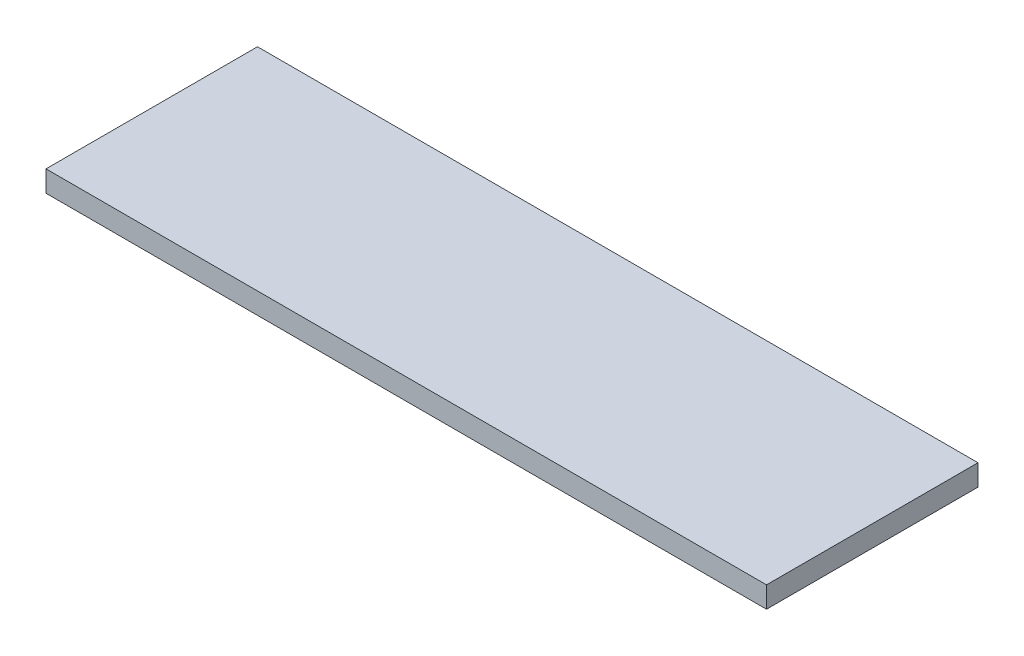
ISO-10303-21;
HEADER;
FILE_DESCRIPTION(('STEP AP214'),'2;1');
FILE_NAME('part.step','',(''),(''),'','','');
FILE_SCHEMA(('AUTOMOTIVE_DESIGN { 1 0 10303 214 1 1 1 1 }'));
ENDSEC;
DATA;
#1=APPLICATION_CONTEXT('core data for automotive mechanical design processes');
#2=APPLICATION_PROTOCOL_DEFINITION('international standard','automotive_design',2000,#1);
#3=PRODUCT_CONTEXT('',#1,'mechanical');
#4=PRODUCT('Part','Part','',(#3));
#5=PRODUCT_RELATED_PRODUCT_CATEGORY('part','',(#4));
#6=PRODUCT_DEFINITION_FORMATION('','',#4);
#7=PRODUCT_DEFINITION_CONTEXT('part definition',#1,'design');
#8=PRODUCT_DEFINITION('design','',#6,#7);
#9=PRODUCT_DEFINITION_SHAPE('','',#8);
#10=(LENGTH_UNIT() NAMED_UNIT(*) SI_UNIT(.MILLI.,.METRE.));
#11=(NAMED_UNIT(*) PLANE_ANGLE_UNIT() SI_UNIT($,.RADIAN.));
#12=(NAMED_UNIT(*) SI_UNIT($,.STERADIAN.) SOLID_ANGLE_UNIT());
#13=UNCERTAINTY_MEASURE_WITH_UNIT(LENGTH_MEASURE(1.E-05),#10,'distance_accuracy_value','');
#14=(GEOMETRIC_REPRESENTATION_CONTEXT(3) GLOBAL_UNCERTAINTY_ASSIGNED_CONTEXT((#13)) GLOBAL_UNIT_ASSIGNED_CONTEXT((#10,
#11,#12)) REPRESENTATION_CONTEXT('',''));
#15=CARTESIAN_POINT('',(0.,0.,0.));
#16=DIRECTION('',(0.,0.,1.));
#17=DIRECTION('',(1.,0.,0.));
#18=AXIS2_PLACEMENT_3D('',#15,#16,#17);
#19=CARTESIAN_POINT('',(18.068583470577,4.,10.));
#20=DIRECTION('',(0.,0.,1.));
#21=DIRECTION('',(0.,-1.,0.));
#22=AXIS2_PLACEMENT_3D('',#19,#20,#21);
#23=PLANE('',#22);
#24=DIRECTION('',(1.,0.,0.));
#25=VECTOR('',#24,1.);
#26=CARTESIAN_POINT('',(19.068583470577,0.,10.));
#27=LINE('',#26,#25);
#28=CARTESIAN_POINT('',(0.,0.,10.));
#29=VERTEX_POINT('',#28);
#30=CARTESIAN_POINT('',(34.068583470577,0.,10.));
#31=VERTEX_POINT('',#30);
#32=EDGE_CURVE('E102',#29,#31,#27,.T.);
#33=ORIENTED_EDGE('',*,*,#32,.F.);
#34=DIRECTION('',(0.,1.,0.));
#35=VECTOR('',#34,1.);
#36=CARTESIAN_POINT('',(0.,-1.,10.));
#37=LINE('',#36,#35);
#38=CARTESIAN_POINT('',(0.,-1.,10.));
#39=VERTEX_POINT('',#38);
#40=EDGE_CURVE('E99',#39,#29,#37,.T.);
#41=ORIENTED_EDGE('',*,*,#40,.F.);
#42=DIRECTION('',(1.,0.,0.));
#43=VECTOR('',#42,1.);
#44=CARTESIAN_POINT('',(19.068583470577,-1.,10.));
#45=LINE('',#44,#43);
#46=CARTESIAN_POINT('',(34.068583470577,-1.,10.));
#47=VERTEX_POINT('',#46);
#48=EDGE_CURVE('E88',#39,#47,#45,.T.);
#49=ORIENTED_EDGE('',*,*,#48,.T.);
#50=DIRECTION('',(0.,-1.,0.));
#51=VECTOR('',#50,1.);
#52=CARTESIAN_POINT('',(34.068583470577,0.,10.));
#53=LINE('',#52,#51);
#54=EDGE_CURVE('E91',#31,#47,#53,.T.);
#55=ORIENTED_EDGE('',*,*,#54,.F.);
#56=EDGE_LOOP('',(#33,#41,#49,#55));
#57=FACE_BOUND('',#56,.T.);
#58=ADVANCED_FACE('F44',(#57),#23,.T.);
#59=CARTESIAN_POINT('',(19.068583470577,-1.,10.));
#60=DIRECTION('',(0.,1.,0.));
#61=DIRECTION('',(0.,0.,1.));
#62=AXIS2_PLACEMENT_3D('',#59,#60,#61);
#63=PLANE('',#62);
#64=DIRECTION('',(1.,0.,0.));
#65=VECTOR('',#64,1.);
#66=CARTESIAN_POINT('',(19.068583470577,-1.,0.));
#67=LINE('',#66,#65);
#68=CARTESIAN_POINT('',(0.,-1.,0.));
#69=VERTEX_POINT('',#68);
#70=CARTESIAN_POINT('',(34.068583470577,-1.,0.));
#71=VERTEX_POINT('',#70);
#72=EDGE_CURVE('E77',#69,#71,#67,.T.);
#73=ORIENTED_EDGE('',*,*,#72,.T.);
#74=DIRECTION('',(0.,0.,-1.));
#75=VECTOR('',#74,1.);
#76=CARTESIAN_POINT('',(34.068583470577,-1.,10.));
#77=LINE('',#76,#75);
#78=EDGE_CURVE('E12',#47,#71,#77,.T.);
#79=ORIENTED_EDGE('',*,*,#78,.F.);
#80=ORIENTED_EDGE('',*,*,#48,.F.);
#81=DIRECTION('',(0.,0.,-1.));
#82=VECTOR('',#81,1.);
#83=CARTESIAN_POINT('',(0.,-1.,10.));
#84=LINE('',#83,#82);
#85=EDGE_CURVE('E90',#39,#69,#84,.T.);
#86=ORIENTED_EDGE('',*,*,#85,.T.);
#87=EDGE_LOOP('',(#73,#79,#80,#86));
#88=FACE_BOUND('',#87,.T.);
#89=ADVANCED_FACE('F86',(#88),#63,.F.);
#90=CARTESIAN_POINT('',(34.068583470577,0.,10.));
#91=DIRECTION('',(1.,0.,0.));
#92=DIRECTION('',(0.,0.,1.));
#93=AXIS2_PLACEMENT_3D('',#90,#91,#92);
#94=PLANE('',#93);
#95=DIRECTION('',(0.,-1.,0.));
#96=VECTOR('',#95,1.);
#97=CARTESIAN_POINT('',(34.068583470577,0.,0.));
#98=LINE('',#97,#96);
#99=CARTESIAN_POINT('',(34.068583470577,0.,0.));
#100=VERTEX_POINT('',#99);
#101=EDGE_CURVE('E111',#100,#71,#98,.T.);
#102=ORIENTED_EDGE('',*,*,#101,.F.);
#103=DIRECTION('',(0.,0.,-1.));
#104=VECTOR('',#103,1.);
#105=CARTESIAN_POINT('',(34.068583470577,0.,10.));
#106=LINE('',#105,#104);
#107=EDGE_CURVE('E53',#31,#100,#106,.T.);
#108=ORIENTED_EDGE('',*,*,#107,.F.);
#109=ORIENTED_EDGE('',*,*,#54,.T.);
#110=ORIENTED_EDGE('',*,*,#78,.T.);
#111=EDGE_LOOP('',(#102,#108,#109,#110));
#112=FACE_BOUND('',#111,.T.);
#113=ADVANCED_FACE('F118',(#112),#94,.T.);
#114=CARTESIAN_POINT('',(0.,0.,10.));
#115=DIRECTION('',(0.,1.,0.));
#116=DIRECTION('',(0.,0.,1.));
#117=AXIS2_PLACEMENT_3D('',#114,#115,#116);
#118=PLANE('',#117);
#119=DIRECTION('',(1.,0.,0.));
#120=VECTOR('',#119,1.);
#121=CARTESIAN_POINT('',(19.068583470577,0.,0.));
#122=LINE('',#121,#120);
#123=CARTESIAN_POINT('',(0.,0.,0.));
#124=VERTEX_POINT('',#123);
#125=EDGE_CURVE('E94',#124,#100,#122,.T.);
#126=ORIENTED_EDGE('',*,*,#125,.F.);
#127=DIRECTION('',(0.,0.,-1.));
#128=VECTOR('',#127,1.);
#129=CARTESIAN_POINT('',(0.,0.,10.));
#130=LINE('',#129,#128);
#131=EDGE_CURVE('E106',#29,#124,#130,.T.);
#132=ORIENTED_EDGE('',*,*,#131,.F.);
#133=ORIENTED_EDGE('',*,*,#32,.T.);
#134=ORIENTED_EDGE('',*,*,#107,.T.);
#135=EDGE_LOOP('',(#126,#132,#133,#134));
#136=FACE_BOUND('',#135,.T.);
#137=ADVANCED_FACE('F50',(#136),#118,.T.);
#138=CARTESIAN_POINT('',(23.068583470577,4.,0.));
#139=DIRECTION('',(0.,0.,-1.));
#140=DIRECTION('',(0.,1.,0.));
#141=AXIS2_PLACEMENT_3D('',#138,#139,#140);
#142=PLANE('',#141);
#143=ORIENTED_EDGE('',*,*,#72,.F.);
#144=DIRECTION('',(0.,1.,0.));
#145=VECTOR('',#144,1.);
#146=CARTESIAN_POINT('',(0.,-1.,0.));
#147=LINE('',#146,#145);
#148=EDGE_CURVE('E101',#69,#124,#147,.T.);
#149=ORIENTED_EDGE('',*,*,#148,.T.);
#150=ORIENTED_EDGE('',*,*,#125,.T.);
#151=ORIENTED_EDGE('',*,*,#101,.T.);
#152=EDGE_LOOP('',(#143,#149,#150,#151));
#153=FACE_BOUND('',#152,.T.);
#154=ADVANCED_FACE('F119',(#153),#142,.T.);
#155=CARTESIAN_POINT('',(0.,-1.,10.));
#156=DIRECTION('',(-1.,0.,0.));
#157=DIRECTION('',(0.,0.,1.));
#158=AXIS2_PLACEMENT_3D('',#155,#156,#157);
#159=PLANE('',#158);
#160=ORIENTED_EDGE('',*,*,#148,.F.);
#161=ORIENTED_EDGE('',*,*,#85,.F.);
#162=ORIENTED_EDGE('',*,*,#40,.T.);
#163=ORIENTED_EDGE('',*,*,#131,.T.);
#164=EDGE_LOOP('',(#160,#161,#162,#163));
#165=FACE_BOUND('',#164,.T.);
#166=ADVANCED_FACE('F98',(#165),#159,.T.);
#167=CLOSED_SHELL('',(#58,#89,#113,#137,#154,#166));
#168=MANIFOLD_SOLID_BREP('B2',#167);
#169=ADVANCED_BREP_SHAPE_REPRESENTATION('',(#18,#168),#14);
#170=SHAPE_DEFINITION_REPRESENTATION(#9,#169);
ENDSEC;
END-ISO-10303-21;
